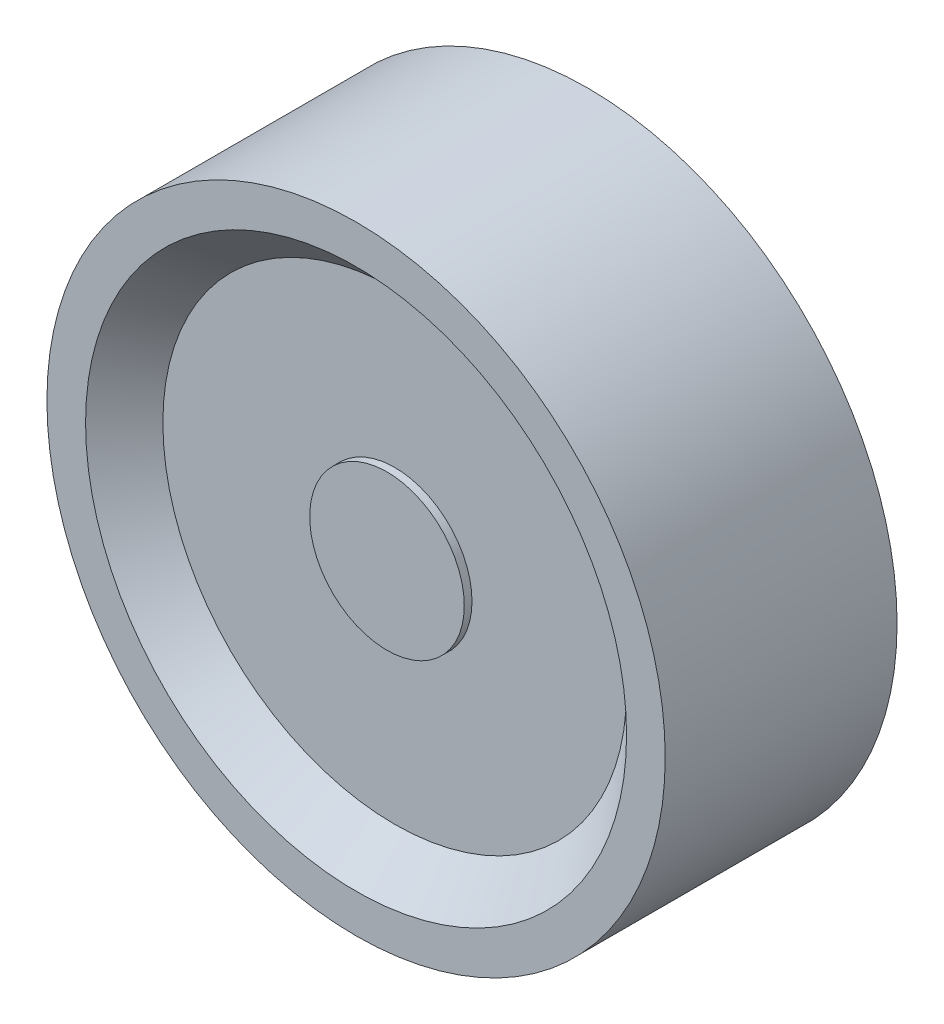
ISO-10303-21;
HEADER;
FILE_DESCRIPTION(('STEP AP214'),'2;1');
FILE_NAME('part.step','',(''),(''),'','','');
FILE_SCHEMA(('AUTOMOTIVE_DESIGN { 1 0 10303 214 1 1 1 1 }'));
ENDSEC;
DATA;
#1=APPLICATION_CONTEXT('core data for automotive mechanical design processes');
#2=APPLICATION_PROTOCOL_DEFINITION('international standard','automotive_design',2000,#1);
#3=PRODUCT_CONTEXT('',#1,'mechanical');
#4=PRODUCT('Part','Part','',(#3));
#5=PRODUCT_RELATED_PRODUCT_CATEGORY('part','',(#4));
#6=PRODUCT_DEFINITION_FORMATION('','',#4);
#7=PRODUCT_DEFINITION_CONTEXT('part definition',#1,'design');
#8=PRODUCT_DEFINITION('design','',#6,#7);
#9=PRODUCT_DEFINITION_SHAPE('','',#8);
#10=(LENGTH_UNIT() NAMED_UNIT(*) SI_UNIT(.MILLI.,.METRE.));
#11=(NAMED_UNIT(*) PLANE_ANGLE_UNIT() SI_UNIT($,.RADIAN.));
#12=(NAMED_UNIT(*) SI_UNIT($,.STERADIAN.) SOLID_ANGLE_UNIT());
#13=UNCERTAINTY_MEASURE_WITH_UNIT(LENGTH_MEASURE(1.E-05),#10,'distance_accuracy_value','');
#14=(GEOMETRIC_REPRESENTATION_CONTEXT(3) GLOBAL_UNCERTAINTY_ASSIGNED_CONTEXT((#13)) GLOBAL_UNIT_ASSIGNED_CONTEXT((#10,
#11,#12)) REPRESENTATION_CONTEXT('',''));
#15=CARTESIAN_POINT('',(0.,0.,0.));
#16=DIRECTION('',(0.,0.,1.));
#17=DIRECTION('',(1.,0.,0.));
#18=AXIS2_PLACEMENT_3D('',#15,#16,#17);
#19=CARTESIAN_POINT('',(0.,0.,0.));
#20=DIRECTION('',(0.,0.,1.));
#21=DIRECTION('',(1.,0.,0.));
#22=AXIS2_PLACEMENT_3D('',#19,#20,#21);
#23=PLANE('',#22);
#24=CARTESIAN_POINT('',(0.,0.,0.));
#25=DIRECTION('',(0.,0.,-1.));
#26=DIRECTION('',(-1.,0.,0.));
#27=AXIS2_PLACEMENT_3D('',#24,#25,#26);
#28=CIRCLE('',#27,2.54);
#29=CARTESIAN_POINT('',(-2.54,0.,0.));
#30=VERTEX_POINT('',#29);
#31=EDGE_CURVE('E84',#30,#30,#28,.T.);
#32=ORIENTED_EDGE('',*,*,#31,.F.);
#33=EDGE_LOOP('',(#32));
#34=FACE_BOUND('',#33,.T.);
#35=CARTESIAN_POINT('',(0.,0.,0.));
#36=DIRECTION('',(0.,0.,1.));
#37=DIRECTION('',(1.,0.,0.));
#38=AXIS2_PLACEMENT_3D('',#35,#36,#37);
#39=CIRCLE('',#38,101.6);
#40=CARTESIAN_POINT('',(-101.6,0.,0.));
#41=VERTEX_POINT('',#40);
#42=EDGE_CURVE('E11',#41,#41,#39,.T.);
#43=ORIENTED_EDGE('',*,*,#42,.F.);
#44=EDGE_LOOP('',(#43));
#45=FACE_BOUND('',#44,.T.);
#46=ADVANCED_FACE('F46',(#34,#45),#23,.F.);
#47=CARTESIAN_POINT('',(0.,0.,0.));
#48=DIRECTION('',(0.,0.,1.));
#49=DIRECTION('',(1.,0.,0.));
#50=AXIS2_PLACEMENT_3D('',#47,#48,#49);
#51=CYLINDRICAL_SURFACE('',#50,101.6);
#52=CARTESIAN_POINT('',(0.,0.,76.2));
#53=DIRECTION('',(0.,0.,1.));
#54=DIRECTION('',(1.,0.,0.));
#55=AXIS2_PLACEMENT_3D('',#52,#53,#54);
#56=CIRCLE('',#55,101.6);
#57=CARTESIAN_POINT('',(-101.6,0.,76.2));
#58=VERTEX_POINT('',#57);
#59=EDGE_CURVE('E88',#58,#58,#56,.T.);
#60=ORIENTED_EDGE('',*,*,#59,.F.);
#61=DIRECTION('',(0.,0.,-1.));
#62=VECTOR('',#61,1.);
#63=CARTESIAN_POINT('',(-101.6,0.,0.));
#64=LINE('',#63,#62);
#65=EDGE_CURVE('E56',#58,#41,#64,.T.);
#66=ORIENTED_EDGE('',*,*,#65,.T.);
#67=ORIENTED_EDGE('',*,*,#42,.T.);
#68=ORIENTED_EDGE('',*,*,#65,.F.);
#69=EDGE_LOOP('',(#60,#66,#67,#68));
#70=FACE_BOUND('',#69,.T.);
#71=ADVANCED_FACE('F48',(#70),#51,.T.);
#72=CARTESIAN_POINT('',(0.,0.,63.5));
#73=DIRECTION('',(0.,0.,1.));
#74=DIRECTION('',(1.,0.,0.));
#75=AXIS2_PLACEMENT_3D('',#72,#73,#74);
#76=PLANE('',#75);
#77=CARTESIAN_POINT('',(0.,0.,63.5));
#78=DIRECTION('',(0.,0.,-1.));
#79=DIRECTION('',(-1.,0.,0.));
#80=AXIS2_PLACEMENT_3D('',#77,#78,#79);
#81=CIRCLE('',#80,25.4000008106232);
#82=CARTESIAN_POINT('',(25.4000008106232,0.,63.5));
#83=VERTEX_POINT('',#82);
#84=EDGE_CURVE('E79',#83,#83,#81,.T.);
#85=ORIENTED_EDGE('',*,*,#84,.T.);
#86=EDGE_LOOP('',(#85));
#87=FACE_BOUND('',#86,.T.);
#88=CARTESIAN_POINT('',(0.,0.,63.5));
#89=DIRECTION('',(0.,0.,-1.));
#90=DIRECTION('',(-1.,0.,0.));
#91=AXIS2_PLACEMENT_3D('',#88,#89,#90);
#92=CIRCLE('',#91,76.2);
#93=CARTESIAN_POINT('',(76.2,0.,63.5));
#94=VERTEX_POINT('',#93);
#95=EDGE_CURVE('E91',#94,#94,#92,.T.);
#96=ORIENTED_EDGE('',*,*,#95,.F.);
#97=EDGE_LOOP('',(#96));
#98=FACE_BOUND('',#97,.T.);
#99=ADVANCED_FACE('F114',(#87,#98),#76,.T.);
#100=CARTESIAN_POINT('',(0.,0.,76.2));
#101=DIRECTION('',(0.,0.,1.));
#102=DIRECTION('',(1.,0.,0.));
#103=AXIS2_PLACEMENT_3D('',#100,#101,#102);
#104=PLANE('',#103);
#105=CARTESIAN_POINT('',(0.,0.,76.2));
#106=DIRECTION('',(0.,0.,1.));
#107=DIRECTION('',(-1.,0.,0.));
#108=AXIS2_PLACEMENT_3D('',#105,#106,#107);
#109=CIRCLE('',#108,88.9);
#110=CARTESIAN_POINT('',(88.9,0.,76.2));
#111=VERTEX_POINT('',#110);
#112=EDGE_CURVE('E92',#111,#111,#109,.T.);
#113=ORIENTED_EDGE('',*,*,#112,.F.);
#114=EDGE_LOOP('',(#113));
#115=FACE_BOUND('',#114,.T.);
#116=ORIENTED_EDGE('',*,*,#59,.T.);
#117=EDGE_LOOP('',(#116));
#118=FACE_BOUND('',#117,.T.);
#119=ADVANCED_FACE('F111',(#115,#118),#104,.T.);
#120=CARTESIAN_POINT('',(0.,0.,69.85));
#121=DIRECTION('',(0.,0.,1.));
#122=DIRECTION('',(-1.,0.,0.));
#123=AXIS2_PLACEMENT_3D('',#120,#121,#122);
#124=CONICAL_SURFACE('',#123,82.55,0.785398163397448);
#125=ORIENTED_EDGE('',*,*,#112,.T.);
#126=DIRECTION('',(-0.707106781186547,0.,-0.707106781186548));
#127=VECTOR('',#126,1.);
#128=CARTESIAN_POINT('',(82.55,0.,69.85));
#129=LINE('',#128,#127);
#130=EDGE_CURVE('E89',#111,#94,#129,.T.);
#131=ORIENTED_EDGE('',*,*,#130,.T.);
#132=ORIENTED_EDGE('',*,*,#95,.T.);
#133=ORIENTED_EDGE('',*,*,#130,.F.);
#134=EDGE_LOOP('',(#125,#131,#132,#133));
#135=FACE_BOUND('',#134,.T.);
#136=ADVANCED_FACE('F113',(#135),#124,.F.);
#137=CARTESIAN_POINT('',(0.,0.,66.04));
#138=DIRECTION('',(0.,0.,1.));
#139=DIRECTION('',(1.,0.,0.));
#140=AXIS2_PLACEMENT_3D('',#137,#138,#139);
#141=PLANE('',#140);
#142=CARTESIAN_POINT('',(0.,0.,66.04));
#143=DIRECTION('',(0.,0.,1.));
#144=DIRECTION('',(-1.,0.,0.));
#145=AXIS2_PLACEMENT_3D('',#142,#143,#144);
#146=CIRCLE('',#145,25.4000008106232);
#147=CARTESIAN_POINT('',(25.4000008106232,0.,66.04));
#148=VERTEX_POINT('',#147);
#149=EDGE_CURVE('E78',#148,#148,#146,.T.);
#150=ORIENTED_EDGE('',*,*,#149,.T.);
#151=EDGE_LOOP('',(#150));
#152=FACE_BOUND('',#151,.T.);
#153=ADVANCED_FACE('F81',(#152),#141,.T.);
#154=CARTESIAN_POINT('',(0.,0.,63.5));
#155=DIRECTION('',(0.,0.,1.));
#156=DIRECTION('',(-1.,0.,0.));
#157=AXIS2_PLACEMENT_3D('',#154,#155,#156);
#158=CYLINDRICAL_SURFACE('',#157,25.4000008106232);
#159=ORIENTED_EDGE('',*,*,#149,.F.);
#160=DIRECTION('',(0.,0.,-1.));
#161=VECTOR('',#160,1.);
#162=CARTESIAN_POINT('',(25.4000008106232,0.,63.5));
#163=LINE('',#162,#161);
#164=EDGE_CURVE('E50',#148,#83,#163,.T.);
#165=ORIENTED_EDGE('',*,*,#164,.T.);
#166=ORIENTED_EDGE('',*,*,#84,.F.);
#167=ORIENTED_EDGE('',*,*,#164,.F.);
#168=EDGE_LOOP('',(#159,#165,#166,#167));
#169=FACE_BOUND('',#168,.T.);
#170=ADVANCED_FACE('F77',(#169),#158,.T.);
#171=CARTESIAN_POINT('',(0.,0.,5.08));
#172=DIRECTION('',(0.,0.,-1.));
#173=DIRECTION('',(-1.,0.,0.));
#174=AXIS2_PLACEMENT_3D('',#171,#172,#173);
#175=CYLINDRICAL_SURFACE('',#174,2.54);
#176=CARTESIAN_POINT('',(0.,0.,5.08));
#177=DIRECTION('',(0.,0.,-1.));
#178=DIRECTION('',(-1.,0.,0.));
#179=AXIS2_PLACEMENT_3D('',#176,#177,#178);
#180=CIRCLE('',#179,2.54);
#181=CARTESIAN_POINT('',(-2.54,0.,5.08));
#182=VERTEX_POINT('',#181);
#183=EDGE_CURVE('E82',#182,#182,#180,.T.);
#184=ORIENTED_EDGE('',*,*,#183,.F.);
#185=EDGE_LOOP('',(#184));
#186=FACE_BOUND('',#185,.T.);
#187=ORIENTED_EDGE('',*,*,#31,.T.);
#188=EDGE_LOOP('',(#187));
#189=FACE_BOUND('',#188,.T.);
#190=ADVANCED_FACE('F104',(#186,#189),#175,.F.);
#191=CARTESIAN_POINT('',(0.,0.,5.08));
#192=DIRECTION('',(0.,0.,-1.));
#193=DIRECTION('',(-1.,0.,0.));
#194=AXIS2_PLACEMENT_3D('',#191,#192,#193);
#195=PLANE('',#194);
#196=ORIENTED_EDGE('',*,*,#183,.T.);
#197=EDGE_LOOP('',(#196));
#198=FACE_BOUND('',#197,.T.);
#199=ADVANCED_FACE('F132',(#198),#195,.T.);
#200=CLOSED_SHELL('',(#46,#71,#99,#119,#136,#153,#170,#190,#199));
#201=MANIFOLD_SOLID_BREP('B2',#200);
#202=ADVANCED_BREP_SHAPE_REPRESENTATION('',(#18,#201),#14);
#203=SHAPE_DEFINITION_REPRESENTATION(#9,#202);
ENDSEC;
END-ISO-10303-21;
